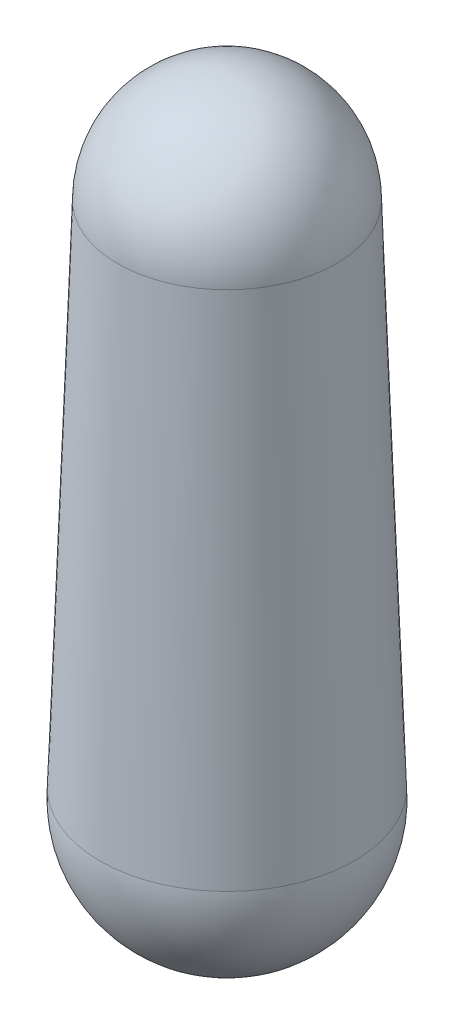
ISO-10303-21;
HEADER;
FILE_DESCRIPTION(('STEP AP214'),'2;1');
FILE_NAME('part.step','',(''),(''),'','','');
FILE_SCHEMA(('AUTOMOTIVE_DESIGN { 1 0 10303 214 1 1 1 1 }'));
ENDSEC;
DATA;
#1=APPLICATION_CONTEXT('core data for automotive mechanical design processes');
#2=APPLICATION_PROTOCOL_DEFINITION('international standard','automotive_design',2000,#1);
#3=PRODUCT_CONTEXT('',#1,'mechanical');
#4=PRODUCT('Part','Part','',(#3));
#5=PRODUCT_RELATED_PRODUCT_CATEGORY('part','',(#4));
#6=PRODUCT_DEFINITION_FORMATION('','',#4);
#7=PRODUCT_DEFINITION_CONTEXT('part definition',#1,'design');
#8=PRODUCT_DEFINITION('design','',#6,#7);
#9=PRODUCT_DEFINITION_SHAPE('','',#8);
#10=(LENGTH_UNIT() NAMED_UNIT(*) SI_UNIT(.MILLI.,.METRE.));
#11=(NAMED_UNIT(*) PLANE_ANGLE_UNIT() SI_UNIT($,.RADIAN.));
#12=(NAMED_UNIT(*) SI_UNIT($,.STERADIAN.) SOLID_ANGLE_UNIT());
#13=UNCERTAINTY_MEASURE_WITH_UNIT(LENGTH_MEASURE(1.E-05),#10,'distance_accuracy_value','');
#14=(GEOMETRIC_REPRESENTATION_CONTEXT(3) GLOBAL_UNCERTAINTY_ASSIGNED_CONTEXT((#13)) GLOBAL_UNIT_ASSIGNED_CONTEXT((#10,
#11,#12)) REPRESENTATION_CONTEXT('',''));
#15=CARTESIAN_POINT('',(0.,0.,0.));
#16=DIRECTION('',(0.,0.,1.));
#17=DIRECTION('',(1.,0.,0.));
#18=AXIS2_PLACEMENT_3D('',#15,#16,#17);
#19=CARTESIAN_POINT('',(0.,0.,0.));
#20=DIRECTION('',(0.,0.,1.));
#21=DIRECTION('',(1.,0.,0.));
#22=AXIS2_PLACEMENT_3D('',#19,#20,#21);
#23=SPHERICAL_SURFACE('',#22,1.97);
#24=CARTESIAN_POINT('',(0.,0.,0.));
#25=DIRECTION('',(0.,1.,0.));
#26=DIRECTION('',(0.,0.,1.));
#27=AXIS2_PLACEMENT_3D('',#24,#25,#26);
#28=SPHERICAL_SURFACE('',#27,1.97);
#29=CARTESIAN_POINT('',(0.,0.137420253276064,0.));
#30=DIRECTION('',(0.,1.,0.));
#31=DIRECTION('',(0.,0.,1.));
#32=AXIS2_PLACEMENT_3D('',#29,#30,#31);
#33=CIRCLE('',#32,1.96520117901185);
#34=CARTESIAN_POINT('',(0.,0.137420253276064,1.96520117901185));
#35=VERTEX_POINT('',#34);
#36=EDGE_CURVE('E10',#35,#35,#33,.F.);
#37=ORIENTED_EDGE('',*,*,#36,.T.);
#38=EDGE_LOOP('',(#37));
#39=FACE_BOUND('',#38,.T.);
#40=ADVANCED_FACE('F35',(#39),#28,.T.);
#41=CARTESIAN_POINT('',(0.,0.,0.));
#42=DIRECTION('',(0.,-1.,0.));
#43=DIRECTION('',(0.,0.,-1.));
#44=AXIS2_PLACEMENT_3D('',#41,#42,#43);
#45=CONICAL_SURFACE('',#44,1.97,0.0349065850398866);
#46=CARTESIAN_POINT('',(0.,8.,0.));
#47=DIRECTION('',(0.,-1.,0.));
#48=DIRECTION('',(0.,0.,-1.));
#49=AXIS2_PLACEMENT_3D('',#46,#47,#48);
#50=CIRCLE('',#49,1.69063384406602);
#51=CARTESIAN_POINT('',(0.,8.,-1.69063384406602));
#52=VERTEX_POINT('',#51);
#53=EDGE_CURVE('E41',#52,#52,#50,.T.);
#54=ORIENTED_EDGE('',*,*,#53,.T.);
#55=EDGE_LOOP('',(#54));
#56=FACE_BOUND('',#55,.T.);
#57=ORIENTED_EDGE('',*,*,#36,.F.);
#58=EDGE_LOOP('',(#57));
#59=FACE_BOUND('',#58,.T.);
#60=ADVANCED_FACE('F47',(#56,#59),#45,.T.);
#61=CARTESIAN_POINT('',(0.,8.,0.));
#62=DIRECTION('',(0.,0.,1.));
#63=DIRECTION('',(1.,0.,0.));
#64=AXIS2_PLACEMENT_3D('',#61,#62,#63);
#65=SPHERICAL_SURFACE('',#64,1.69063384406602);
#66=CARTESIAN_POINT('',(0.,8.,0.));
#67=DIRECTION('',(0.,-1.,0.));
#68=DIRECTION('',(0.,0.,-1.));
#69=AXIS2_PLACEMENT_3D('',#66,#67,#68);
#70=SPHERICAL_SURFACE('',#69,1.69063384406602);
#71=ORIENTED_EDGE('',*,*,#53,.F.);
#72=EDGE_LOOP('',(#71));
#73=FACE_BOUND('',#72,.T.);
#74=ADVANCED_FACE('F50',(#73),#70,.T.);
#75=CLOSED_SHELL('',(#40,#60,#74));
#76=MANIFOLD_SOLID_BREP('B2',#75);
#77=ADVANCED_BREP_SHAPE_REPRESENTATION('',(#18,#76),#14);
#78=SHAPE_DEFINITION_REPRESENTATION(#9,#77);
ENDSEC;
END-ISO-10303-21;
